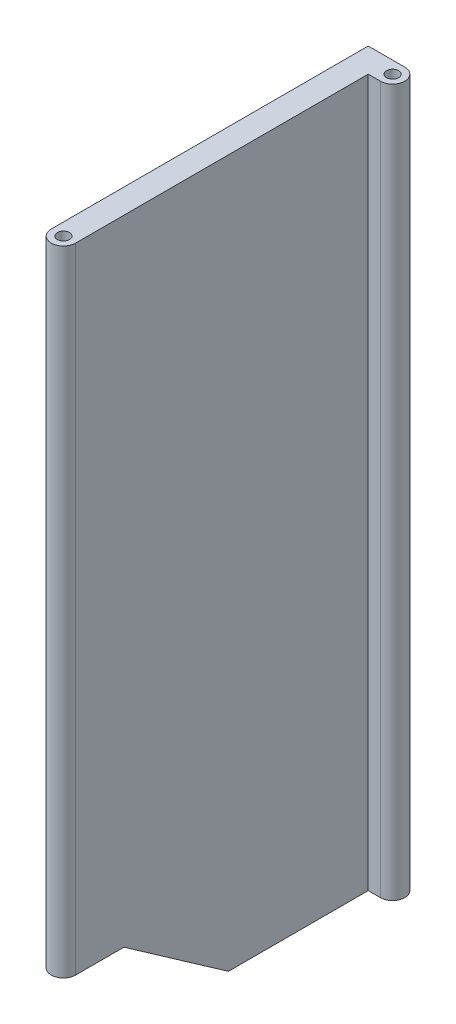
ISO-10303-21;
HEADER;
FILE_DESCRIPTION(('STEP AP214'),'2;1');
FILE_NAME('part.step','',(''),(''),'','','');
FILE_SCHEMA(('AUTOMOTIVE_DESIGN { 1 0 10303 214 1 1 1 1 }'));
ENDSEC;
DATA;
#1=APPLICATION_CONTEXT('core data for automotive mechanical design processes');
#2=APPLICATION_PROTOCOL_DEFINITION('international standard','automotive_design',2000,#1);
#3=PRODUCT_CONTEXT('',#1,'mechanical');
#4=PRODUCT('Part','Part','',(#3));
#5=PRODUCT_RELATED_PRODUCT_CATEGORY('part','',(#4));
#6=PRODUCT_DEFINITION_FORMATION('','',#4);
#7=PRODUCT_DEFINITION_CONTEXT('part definition',#1,'design');
#8=PRODUCT_DEFINITION('design','',#6,#7);
#9=PRODUCT_DEFINITION_SHAPE('','',#8);
#10=(LENGTH_UNIT() NAMED_UNIT(*) SI_UNIT(.MILLI.,.METRE.));
#11=(NAMED_UNIT(*) PLANE_ANGLE_UNIT() SI_UNIT($,.RADIAN.));
#12=(NAMED_UNIT(*) SI_UNIT($,.STERADIAN.) SOLID_ANGLE_UNIT());
#13=UNCERTAINTY_MEASURE_WITH_UNIT(LENGTH_MEASURE(1.E-05),#10,'distance_accuracy_value','');
#14=(GEOMETRIC_REPRESENTATION_CONTEXT(3) GLOBAL_UNCERTAINTY_ASSIGNED_CONTEXT((#13)) GLOBAL_UNIT_ASSIGNED_CONTEXT((#10,
#11,#12)) REPRESENTATION_CONTEXT('',''));
#15=CARTESIAN_POINT('',(0.,0.,0.));
#16=DIRECTION('',(0.,0.,1.));
#17=DIRECTION('',(1.,0.,0.));
#18=AXIS2_PLACEMENT_3D('',#15,#16,#17);
#19=CARTESIAN_POINT('',(2.,0.,0.));
#20=DIRECTION('',(1.,0.,0.));
#21=DIRECTION('',(0.,0.,-1.));
#22=AXIS2_PLACEMENT_3D('',#19,#20,#21);
#23=PLANE('',#22);
#24=DIRECTION('',(0.,0.,-1.));
#25=VECTOR('',#24,1.);
#26=CARTESIAN_POINT('',(2.,0.,13.4660843857069));
#27=LINE('',#26,#25);
#28=CARTESIAN_POINT('',(2.,0.,13.4660843857069));
#29=VERTEX_POINT('',#28);
#30=CARTESIAN_POINT('',(2.,0.,2.));
#31=VERTEX_POINT('',#30);
#32=EDGE_CURVE('E49',#29,#31,#27,.T.);
#33=ORIENTED_EDGE('',*,*,#32,.T.);
#34=DIRECTION('',(0.,-1.,0.));
#35=VECTOR('',#34,1.);
#36=CARTESIAN_POINT('',(2.,60.8284271247462,2.));
#37=LINE('',#36,#35);
#38=CARTESIAN_POINT('',(2.,58.,2.));
#39=VERTEX_POINT('',#38);
#40=EDGE_CURVE('E151',#39,#31,#37,.T.);
#41=ORIENTED_EDGE('',*,*,#40,.F.);
#42=DIRECTION('',(0.,0.,1.));
#43=VECTOR('',#42,1.);
#44=CARTESIAN_POINT('',(2.,58.,0.));
#45=LINE('',#44,#43);
#46=CARTESIAN_POINT('',(2.,58.,26.));
#47=VERTEX_POINT('',#46);
#48=EDGE_CURVE('E101',#39,#47,#45,.T.);
#49=ORIENTED_EDGE('',*,*,#48,.T.);
#50=DIRECTION('',(0.,-1.,0.));
#51=VECTOR('',#50,1.);
#52=CARTESIAN_POINT('',(2.,58.,26.));
#53=LINE('',#52,#51);
#54=CARTESIAN_POINT('',(2.,6.00000000000001,26.));
#55=VERTEX_POINT('',#54);
#56=EDGE_CURVE('E125',#47,#55,#53,.T.);
#57=ORIENTED_EDGE('',*,*,#56,.T.);
#58=DIRECTION('',(0.,0.,-1.));
#59=VECTOR('',#58,1.);
#60=CARTESIAN_POINT('',(2.,6.00000000000002,25.));
#61=LINE('',#60,#59);
#62=CARTESIAN_POINT('',(2.,6.00000000000002,22.0349724261597));
#63=VERTEX_POINT('',#62);
#64=EDGE_CURVE('E108',#55,#63,#61,.T.);
#65=ORIENTED_EDGE('',*,*,#64,.T.);
#66=DIRECTION('',(0.,-0.573576436351041,-0.819152044288995));
#67=VECTOR('',#66,1.);
#68=CARTESIAN_POINT('',(2.,0.,13.4660843857069));
#69=LINE('',#68,#67);
#70=EDGE_CURVE('E55',#63,#29,#69,.T.);
#71=ORIENTED_EDGE('',*,*,#70,.T.);
#72=EDGE_LOOP('',(#33,#41,#49,#57,#65,#71));
#73=FACE_BOUND('',#72,.T.);
#74=ADVANCED_FACE('F34',(#73),#23,.T.);
#75=CARTESIAN_POINT('',(2.,6.00000000000002,25.));
#76=DIRECTION('',(0.,1.,0.));
#77=DIRECTION('',(0.,0.,1.));
#78=AXIS2_PLACEMENT_3D('',#75,#76,#77);
#79=PLANE('',#78);
#80=DIRECTION('',(0.,0.,-1.));
#81=VECTOR('',#80,1.);
#82=CARTESIAN_POINT('',(0.,6.00000000000002,25.));
#83=LINE('',#82,#81);
#84=CARTESIAN_POINT('',(0.,6.00000000000001,26.));
#85=VERTEX_POINT('',#84);
#86=CARTESIAN_POINT('',(0.,6.00000000000002,22.0349724261597));
#87=VERTEX_POINT('',#86);
#88=EDGE_CURVE('E121',#85,#87,#83,.T.);
#89=ORIENTED_EDGE('',*,*,#88,.T.);
#90=DIRECTION('',(-1.,0.,0.));
#91=VECTOR('',#90,1.);
#92=CARTESIAN_POINT('',(2.,6.00000000000002,22.0349724261597));
#93=LINE('',#92,#91);
#94=EDGE_CURVE('E11',#63,#87,#93,.T.);
#95=ORIENTED_EDGE('',*,*,#94,.F.);
#96=ORIENTED_EDGE('',*,*,#64,.F.);
#97=CARTESIAN_POINT('',(1.,6.00000000000001,26.));
#98=DIRECTION('',(0.,-1.,0.));
#99=DIRECTION('',(0.,0.,1.));
#100=AXIS2_PLACEMENT_3D('',#97,#98,#99);
#101=CIRCLE('',#100,1.);
#102=EDGE_CURVE('E134',#55,#85,#101,.T.);
#103=ORIENTED_EDGE('',*,*,#102,.T.);
#104=EDGE_LOOP('',(#89,#95,#96,#103));
#105=FACE_BOUND('',#104,.T.);
#106=CARTESIAN_POINT('',(1.,6.00000000000001,26.));
#107=DIRECTION('',(0.,-1.,0.));
#108=DIRECTION('',(0.,0.,-1.));
#109=AXIS2_PLACEMENT_3D('',#106,#107,#108);
#110=CIRCLE('',#109,0.5);
#111=CARTESIAN_POINT('',(1.,6.00000000000001,25.5));
#112=VERTEX_POINT('',#111);
#113=EDGE_CURVE('E139',#112,#112,#110,.T.);
#114=ORIENTED_EDGE('',*,*,#113,.F.);
#115=EDGE_LOOP('',(#114));
#116=FACE_BOUND('',#115,.T.);
#117=ADVANCED_FACE('F36',(#105,#116),#79,.F.);
#118=CARTESIAN_POINT('',(2.,0.,13.4660843857069));
#119=DIRECTION('',(0.,0.819152044288995,-0.573576436351041));
#120=DIRECTION('',(0.,0.573576436351041,0.819152044288995));
#121=AXIS2_PLACEMENT_3D('',#118,#119,#120);
#122=PLANE('',#121);
#123=DIRECTION('',(0.,-0.573576436351041,-0.819152044288995));
#124=VECTOR('',#123,1.);
#125=CARTESIAN_POINT('',(0.,0.,13.4660843857069));
#126=LINE('',#125,#124);
#127=CARTESIAN_POINT('',(0.,0.,13.4660843857069));
#128=VERTEX_POINT('',#127);
#129=EDGE_CURVE('E120',#87,#128,#126,.T.);
#130=ORIENTED_EDGE('',*,*,#129,.T.);
#131=DIRECTION('',(-1.,0.,0.));
#132=VECTOR('',#131,1.);
#133=CARTESIAN_POINT('',(2.,0.,13.4660843857069));
#134=LINE('',#133,#132);
#135=EDGE_CURVE('E42',#29,#128,#134,.T.);
#136=ORIENTED_EDGE('',*,*,#135,.F.);
#137=ORIENTED_EDGE('',*,*,#70,.F.);
#138=ORIENTED_EDGE('',*,*,#94,.T.);
#139=EDGE_LOOP('',(#130,#136,#137,#138));
#140=FACE_BOUND('',#139,.T.);
#141=ADVANCED_FACE('F210',(#140),#122,.F.);
#142=CARTESIAN_POINT('',(2.,0.,13.4660843857069));
#143=DIRECTION('',(0.,1.,0.));
#144=DIRECTION('',(0.,0.,1.));
#145=AXIS2_PLACEMENT_3D('',#142,#143,#144);
#146=PLANE('',#145);
#147=DIRECTION('',(0.,0.,-1.));
#148=VECTOR('',#147,1.);
#149=CARTESIAN_POINT('',(0.,0.,13.4660843857069));
#150=LINE('',#149,#148);
#151=CARTESIAN_POINT('',(0.,0.,0.));
#152=VERTEX_POINT('',#151);
#153=EDGE_CURVE('E88',#128,#152,#150,.T.);
#154=ORIENTED_EDGE('',*,*,#153,.T.);
#155=DIRECTION('',(-1.,0.,0.));
#156=VECTOR('',#155,1.);
#157=CARTESIAN_POINT('',(2.,0.,0.));
#158=LINE('',#157,#156);
#159=CARTESIAN_POINT('',(3.,0.,0.));
#160=VERTEX_POINT('',#159);
#161=EDGE_CURVE('E83',#160,#152,#158,.T.);
#162=ORIENTED_EDGE('',*,*,#161,.F.);
#163=CARTESIAN_POINT('',(3.,0.,1.));
#164=DIRECTION('',(0.,1.,0.));
#165=DIRECTION('',(0.,0.,1.));
#166=AXIS2_PLACEMENT_3D('',#163,#164,#165);
#167=CIRCLE('',#166,1.);
#168=CARTESIAN_POINT('',(3.,0.,2.));
#169=VERTEX_POINT('',#168);
#170=EDGE_CURVE('E158',#169,#160,#167,.T.);
#171=ORIENTED_EDGE('',*,*,#170,.F.);
#172=DIRECTION('',(1.,0.,0.));
#173=VECTOR('',#172,1.);
#174=CARTESIAN_POINT('',(2.,0.,2.));
#175=LINE('',#174,#173);
#176=EDGE_CURVE('E147',#31,#169,#175,.T.);
#177=ORIENTED_EDGE('',*,*,#176,.F.);
#178=ORIENTED_EDGE('',*,*,#32,.F.);
#179=ORIENTED_EDGE('',*,*,#135,.T.);
#180=EDGE_LOOP('',(#154,#162,#171,#177,#178,#179));
#181=FACE_BOUND('',#180,.T.);
#182=CARTESIAN_POINT('',(3.,0.,1.));
#183=DIRECTION('',(0.,1.,0.));
#184=DIRECTION('',(0.,0.,1.));
#185=AXIS2_PLACEMENT_3D('',#182,#183,#184);
#186=CIRCLE('',#185,0.5);
#187=CARTESIAN_POINT('',(3.,0.,1.5));
#188=VERTEX_POINT('',#187);
#189=EDGE_CURVE('E155',#188,#188,#186,.T.);
#190=ORIENTED_EDGE('',*,*,#189,.T.);
#191=EDGE_LOOP('',(#190));
#192=FACE_BOUND('',#191,.T.);
#193=ADVANCED_FACE('F115',(#181,#192),#146,.F.);
#194=CARTESIAN_POINT('',(2.,0.,0.));
#195=DIRECTION('',(0.,0.,1.));
#196=DIRECTION('',(1.,0.,0.));
#197=AXIS2_PLACEMENT_3D('',#194,#195,#196);
#198=PLANE('',#197);
#199=DIRECTION('',(0.,1.,0.));
#200=VECTOR('',#199,1.);
#201=CARTESIAN_POINT('',(0.,0.,0.));
#202=LINE('',#201,#200);
#203=CARTESIAN_POINT('',(0.,58.,0.));
#204=VERTEX_POINT('',#203);
#205=EDGE_CURVE('E75',#152,#204,#202,.T.);
#206=ORIENTED_EDGE('',*,*,#205,.T.);
#207=DIRECTION('',(-1.,0.,0.));
#208=VECTOR('',#207,1.);
#209=CARTESIAN_POINT('',(2.,58.,0.));
#210=LINE('',#209,#208);
#211=CARTESIAN_POINT('',(3.,58.,0.));
#212=VERTEX_POINT('',#211);
#213=EDGE_CURVE('E80',#212,#204,#210,.T.);
#214=ORIENTED_EDGE('',*,*,#213,.F.);
#215=DIRECTION('',(0.,-1.,0.));
#216=VECTOR('',#215,1.);
#217=CARTESIAN_POINT('',(3.,60.8284271247462,0.));
#218=LINE('',#217,#216);
#219=EDGE_CURVE('E152',#212,#160,#218,.T.);
#220=ORIENTED_EDGE('',*,*,#219,.T.);
#221=ORIENTED_EDGE('',*,*,#161,.T.);
#222=EDGE_LOOP('',(#206,#214,#220,#221));
#223=FACE_BOUND('',#222,.T.);
#224=ADVANCED_FACE('F77',(#223),#198,.F.);
#225=CARTESIAN_POINT('',(2.,58.,0.));
#226=DIRECTION('',(0.,-1.,0.));
#227=DIRECTION('',(0.,0.,-1.));
#228=AXIS2_PLACEMENT_3D('',#225,#226,#227);
#229=PLANE('',#228);
#230=DIRECTION('',(0.,0.,1.));
#231=VECTOR('',#230,1.);
#232=CARTESIAN_POINT('',(0.,58.,0.));
#233=LINE('',#232,#231);
#234=CARTESIAN_POINT('',(0.,58.,26.));
#235=VERTEX_POINT('',#234);
#236=EDGE_CURVE('E87',#204,#235,#233,.T.);
#237=ORIENTED_EDGE('',*,*,#236,.T.);
#238=CARTESIAN_POINT('',(1.,58.,26.));
#239=DIRECTION('',(0.,-1.,0.));
#240=DIRECTION('',(0.,0.,1.));
#241=AXIS2_PLACEMENT_3D('',#238,#239,#240);
#242=CIRCLE('',#241,1.);
#243=EDGE_CURVE('E131',#47,#235,#242,.T.);
#244=ORIENTED_EDGE('',*,*,#243,.F.);
#245=ORIENTED_EDGE('',*,*,#48,.F.);
#246=DIRECTION('',(-1.,0.,0.));
#247=VECTOR('',#246,1.);
#248=CARTESIAN_POINT('',(2.,58.,2.));
#249=LINE('',#248,#247);
#250=CARTESIAN_POINT('',(3.,58.,2.));
#251=VERTEX_POINT('',#250);
#252=EDGE_CURVE('E148',#251,#39,#249,.T.);
#253=ORIENTED_EDGE('',*,*,#252,.F.);
#254=CARTESIAN_POINT('',(3.,58.,1.));
#255=DIRECTION('',(0.,-1.,0.));
#256=DIRECTION('',(0.,0.,-1.));
#257=AXIS2_PLACEMENT_3D('',#254,#255,#256);
#258=CIRCLE('',#257,1.);
#259=EDGE_CURVE('E99',#212,#251,#258,.T.);
#260=ORIENTED_EDGE('',*,*,#259,.F.);
#261=ORIENTED_EDGE('',*,*,#213,.T.);
#262=EDGE_LOOP('',(#237,#244,#245,#253,#260,#261));
#263=FACE_BOUND('',#262,.T.);
#264=CARTESIAN_POINT('',(1.,58.,26.));
#265=DIRECTION('',(0.,-1.,0.));
#266=DIRECTION('',(0.,0.,-1.));
#267=AXIS2_PLACEMENT_3D('',#264,#265,#266);
#268=CIRCLE('',#267,0.5);
#269=CARTESIAN_POINT('',(1.,58.,25.5));
#270=VERTEX_POINT('',#269);
#271=EDGE_CURVE('E137',#270,#270,#268,.T.);
#272=ORIENTED_EDGE('',*,*,#271,.T.);
#273=EDGE_LOOP('',(#272));
#274=FACE_BOUND('',#273,.T.);
#275=CARTESIAN_POINT('',(3.,58.,1.));
#276=DIRECTION('',(0.,-1.,0.));
#277=DIRECTION('',(0.,0.,-1.));
#278=AXIS2_PLACEMENT_3D('',#275,#276,#277);
#279=CIRCLE('',#278,0.5);
#280=CARTESIAN_POINT('',(3.,58.,0.5));
#281=VERTEX_POINT('',#280);
#282=EDGE_CURVE('E142',#281,#281,#279,.T.);
#283=ORIENTED_EDGE('',*,*,#282,.T.);
#284=EDGE_LOOP('',(#283));
#285=FACE_BOUND('',#284,.T.);
#286=ADVANCED_FACE('F92',(#263,#274,#285),#229,.F.);
#287=CARTESIAN_POINT('',(0.,0.,0.));
#288=DIRECTION('',(1.,0.,0.));
#289=DIRECTION('',(0.,0.,-1.));
#290=AXIS2_PLACEMENT_3D('',#287,#288,#289);
#291=PLANE('',#290);
#292=ORIENTED_EDGE('',*,*,#88,.F.);
#293=DIRECTION('',(0.,-1.,0.));
#294=VECTOR('',#293,1.);
#295=CARTESIAN_POINT('',(0.,58.,26.));
#296=LINE('',#295,#294);
#297=EDGE_CURVE('E106',#235,#85,#296,.T.);
#298=ORIENTED_EDGE('',*,*,#297,.F.);
#299=ORIENTED_EDGE('',*,*,#236,.F.);
#300=ORIENTED_EDGE('',*,*,#205,.F.);
#301=ORIENTED_EDGE('',*,*,#153,.F.);
#302=ORIENTED_EDGE('',*,*,#129,.F.);
#303=EDGE_LOOP('',(#292,#298,#299,#300,#301,#302));
#304=FACE_BOUND('',#303,.T.);
#305=ADVANCED_FACE('F104',(#304),#291,.F.);
#306=CARTESIAN_POINT('',(1.,58.,26.));
#307=DIRECTION('',(0.,-1.,0.));
#308=DIRECTION('',(0.,0.,-1.));
#309=AXIS2_PLACEMENT_3D('',#306,#307,#308);
#310=CYLINDRICAL_SURFACE('',#309,1.);
#311=ORIENTED_EDGE('',*,*,#102,.F.);
#312=ORIENTED_EDGE('',*,*,#56,.F.);
#313=ORIENTED_EDGE('',*,*,#243,.T.);
#314=ORIENTED_EDGE('',*,*,#297,.T.);
#315=EDGE_LOOP('',(#311,#312,#313,#314));
#316=FACE_BOUND('',#315,.T.);
#317=ADVANCED_FACE('F192',(#316),#310,.T.);
#318=CARTESIAN_POINT('',(1.,58.,26.));
#319=DIRECTION('',(0.,-1.,0.));
#320=DIRECTION('',(0.,0.,-1.));
#321=AXIS2_PLACEMENT_3D('',#318,#319,#320);
#322=CYLINDRICAL_SURFACE('',#321,0.5);
#323=ORIENTED_EDGE('',*,*,#271,.F.);
#324=EDGE_LOOP('',(#323));
#325=FACE_BOUND('',#324,.T.);
#326=ORIENTED_EDGE('',*,*,#113,.T.);
#327=EDGE_LOOP('',(#326));
#328=FACE_BOUND('',#327,.T.);
#329=ADVANCED_FACE('F196',(#325,#328),#322,.F.);
#330=CARTESIAN_POINT('',(3.,60.8284271247462,1.));
#331=DIRECTION('',(0.,-1.,0.));
#332=DIRECTION('',(0.,0.,-1.));
#333=AXIS2_PLACEMENT_3D('',#330,#331,#332);
#334=CYLINDRICAL_SURFACE('',#333,1.);
#335=ORIENTED_EDGE('',*,*,#219,.F.);
#336=ORIENTED_EDGE('',*,*,#259,.T.);
#337=DIRECTION('',(0.,-1.,0.));
#338=VECTOR('',#337,1.);
#339=CARTESIAN_POINT('',(3.,60.8284271247462,2.));
#340=LINE('',#339,#338);
#341=EDGE_CURVE('E154',#251,#169,#340,.T.);
#342=ORIENTED_EDGE('',*,*,#341,.T.);
#343=ORIENTED_EDGE('',*,*,#170,.T.);
#344=EDGE_LOOP('',(#335,#336,#342,#343));
#345=FACE_BOUND('',#344,.T.);
#346=ADVANCED_FACE('F175',(#345),#334,.T.);
#347=CARTESIAN_POINT('',(2.,60.8284271247462,2.));
#348=DIRECTION('',(0.,0.,-1.));
#349=DIRECTION('',(-1.,0.,0.));
#350=AXIS2_PLACEMENT_3D('',#347,#348,#349);
#351=PLANE('',#350);
#352=ORIENTED_EDGE('',*,*,#341,.F.);
#353=ORIENTED_EDGE('',*,*,#252,.T.);
#354=ORIENTED_EDGE('',*,*,#40,.T.);
#355=ORIENTED_EDGE('',*,*,#176,.T.);
#356=EDGE_LOOP('',(#352,#353,#354,#355));
#357=FACE_BOUND('',#356,.T.);
#358=ADVANCED_FACE('F170',(#357),#351,.F.);
#359=CARTESIAN_POINT('',(3.,60.8284271247462,1.));
#360=DIRECTION('',(0.,-1.,0.));
#361=DIRECTION('',(0.,0.,-1.));
#362=AXIS2_PLACEMENT_3D('',#359,#360,#361);
#363=CYLINDRICAL_SURFACE('',#362,0.5);
#364=ORIENTED_EDGE('',*,*,#282,.F.);
#365=EDGE_LOOP('',(#364));
#366=FACE_BOUND('',#365,.T.);
#367=ORIENTED_EDGE('',*,*,#189,.F.);
#368=EDGE_LOOP('',(#367));
#369=FACE_BOUND('',#368,.T.);
#370=ADVANCED_FACE('F291',(#366,#369),#363,.F.);
#371=CLOSED_SHELL('',(#74,#117,#141,#193,#224,#286,#305,#317,#329,#346,#358,#370));
#372=MANIFOLD_SOLID_BREP('B2',#371);
#373=ADVANCED_BREP_SHAPE_REPRESENTATION('',(#18,#372),#14);
#374=SHAPE_DEFINITION_REPRESENTATION(#9,#373);
ENDSEC;
END-ISO-10303-21;
